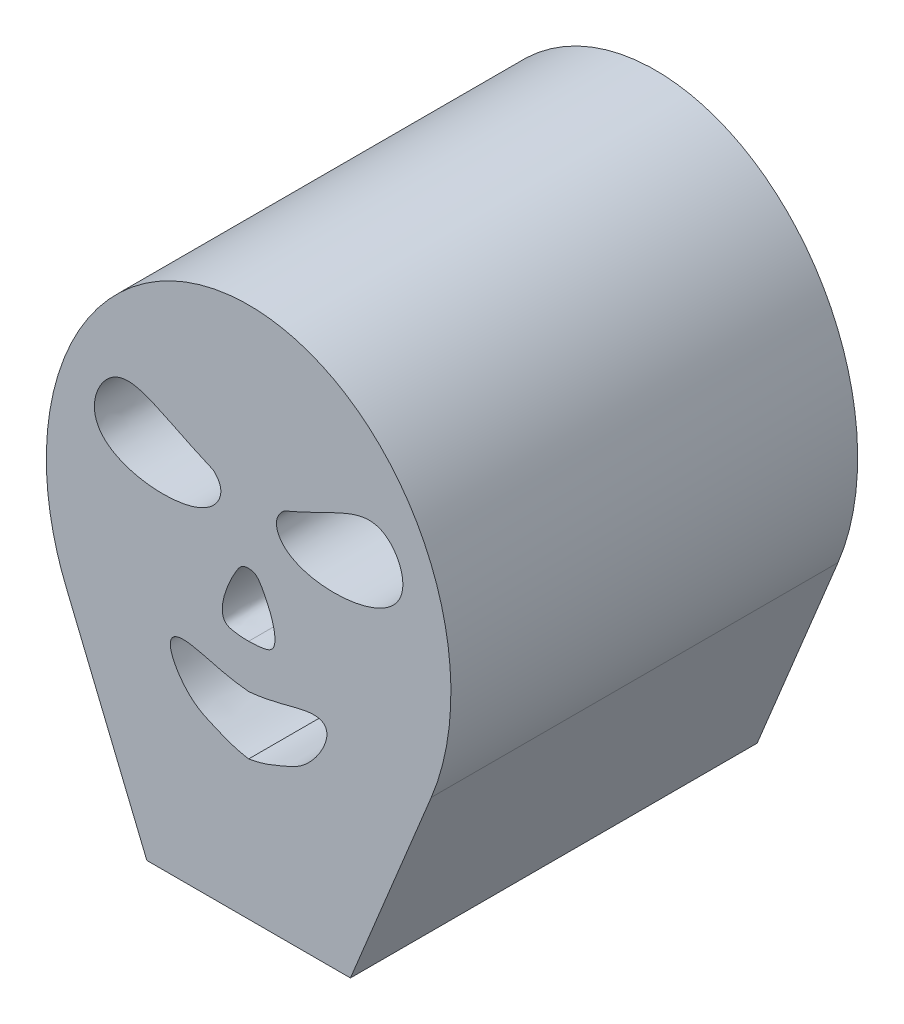
ISO-10303-21;
HEADER;
FILE_DESCRIPTION(('STEP AP214'),'2;1');
FILE_NAME('part.step','',(''),(''),'','','');
FILE_SCHEMA(('AUTOMOTIVE_DESIGN { 1 0 10303 214 1 1 1 1 }'));
ENDSEC;
DATA;
#1=APPLICATION_CONTEXT('core data for automotive mechanical design processes');
#2=APPLICATION_PROTOCOL_DEFINITION('international standard','automotive_design',2000,#1);
#3=PRODUCT_CONTEXT('',#1,'mechanical');
#4=PRODUCT('Part','Part','',(#3));
#5=PRODUCT_RELATED_PRODUCT_CATEGORY('part','',(#4));
#6=PRODUCT_DEFINITION_FORMATION('','',#4);
#7=PRODUCT_DEFINITION_CONTEXT('part definition',#1,'design');
#8=PRODUCT_DEFINITION('design','',#6,#7);
#9=PRODUCT_DEFINITION_SHAPE('','',#8);
#10=(LENGTH_UNIT() NAMED_UNIT(*) SI_UNIT(.MILLI.,.METRE.));
#11=(NAMED_UNIT(*) PLANE_ANGLE_UNIT() SI_UNIT($,.RADIAN.));
#12=(NAMED_UNIT(*) SI_UNIT($,.STERADIAN.) SOLID_ANGLE_UNIT());
#13=UNCERTAINTY_MEASURE_WITH_UNIT(LENGTH_MEASURE(1.E-05),#10,'distance_accuracy_value','');
#14=(GEOMETRIC_REPRESENTATION_CONTEXT(3) GLOBAL_UNCERTAINTY_ASSIGNED_CONTEXT((#13)) GLOBAL_UNIT_ASSIGNED_CONTEXT((#10,
#11,#12)) REPRESENTATION_CONTEXT('',''));
#15=CARTESIAN_POINT('',(0.,0.,0.));
#16=DIRECTION('',(0.,0.,1.));
#17=DIRECTION('',(1.,0.,0.));
#18=AXIS2_PLACEMENT_3D('',#15,#16,#17);
#19=CARTESIAN_POINT('',(-8.064642047272,15.4140386878812,40.));
#20=DIRECTION('',(0.,0.,1.));
#21=DIRECTION('',(1.,0.,0.));
#22=AXIS2_PLACEMENT_3D('',#19,#20,#21);
#23=PLANE('',#22);
#24=CARTESIAN_POINT('',(-8.064642047272,15.4140386878812,40.));
#25=DIRECTION('',(0.,0.,1.));
#26=DIRECTION('',(0.,1.,0.));
#27=AXIS2_PLACEMENT_3D('',#24,#25,#26);
#28=ELLIPSE('',#27,23.0545966616186,19.8957473835431);
#29=CARTESIAN_POINT('',(9.89924815737278,5.50405351147454,40.));
#30=VERTEX_POINT('',#29);
#31=CARTESIAN_POINT('',(-26.0285322519168,5.50405351147454,40.));
#32=VERTEX_POINT('',#31);
#33=EDGE_CURVE('E257',#30,#32,#28,.T.);
#34=ORIENTED_EDGE('',*,*,#33,.T.);
#35=DIRECTION('',(0.380022356894521,-0.924977301483844,0.));
#36=VECTOR('',#35,1.);
#37=CARTESIAN_POINT('',(-26.0285322519168,5.50405351147454,40.));
#38=LINE('',#37,#36);
#39=CARTESIAN_POINT('',(-18.0762874776894,-13.8517706355913,40.));
#40=VERTEX_POINT('',#39);
#41=EDGE_CURVE('E261',#32,#40,#38,.T.);
#42=ORIENTED_EDGE('',*,*,#41,.T.);
#43=DIRECTION('',(1.,0.,0.));
#44=VECTOR('',#43,1.);
#45=CARTESIAN_POINT('',(-18.0762874776894,-13.8517706355913,40.));
#46=LINE('',#45,#44);
#47=CARTESIAN_POINT('',(1.94700338314539,-13.8517706355913,40.));
#48=VERTEX_POINT('',#47);
#49=EDGE_CURVE('E264',#40,#48,#46,.T.);
#50=ORIENTED_EDGE('',*,*,#49,.T.);
#51=DIRECTION('',(0.380022356894521,0.924977301483844,0.));
#52=VECTOR('',#51,1.);
#53=CARTESIAN_POINT('',(9.89924815737278,5.50405351147454,40.));
#54=LINE('',#53,#52);
#55=EDGE_CURVE('E266',#48,#30,#54,.T.);
#56=ORIENTED_EDGE('',*,*,#55,.T.);
#57=EDGE_LOOP('',(#34,#42,#50,#56));
#58=FACE_BOUND('',#57,.T.);
#59=DIRECTION('',(-0.833445640345557,0.552601451852041,0.));
#60=VECTOR('',#59,1.);
#61=CARTESIAN_POINT('',(-11.5967471369434,22.6915395941908,40.));
#62=LINE('',#61,#60);
#63=CARTESIAN_POINT('',(-11.5548218141603,22.6637417473754,40.));
#64=VERTEX_POINT('',#63);
#65=CARTESIAN_POINT('',(-11.5967471369434,22.6915395941908,40.));
#66=VERTEX_POINT('',#65);
#67=EDGE_CURVE('E233',#64,#66,#62,.T.);
#68=ORIENTED_EDGE('',*,*,#67,.F.);
#69=CARTESIAN_POINT('',(-11.5967471369434,22.6915395941908,40.));
#70=CARTESIAN_POINT('',(-21.1696814875945,26.7550091432701,40.));
#71=CARTESIAN_POINT('',(-20.3028079837909,28.7972351380756,40.));
#72=CARTESIAN_POINT('',(-23.3051363778575,25.6278564940178,40.));
#73=CARTESIAN_POINT('',(-24.5512670395752,22.6921566264848,40.));
#74=CARTESIAN_POINT('',(-25.0972126236344,19.9864753193647,40.));
#75=CARTESIAN_POINT('',(-24.6197256741648,18.8046536480547,40.));
#76=CARTESIAN_POINT('',(-22.7689583663723,18.0190495352327,40.));
#77=CARTESIAN_POINT('',(-17.9843212991027,16.5153210880384,40.));
#78=CARTESIAN_POINT('',(-12.4044401506613,16.7076310269674,40.));
#79=CARTESIAN_POINT('',(-11.3713676487825,18.0767617411084,40.));
#80=CARTESIAN_POINT('',(-10.9650206938746,19.0340551761735,40.));
#81=CARTESIAN_POINT('',(-10.3961349570035,20.3742659852647,40.));
#82=CARTESIAN_POINT('',(-10.4539747671032,21.3026395152799,40.));
#83=CARTESIAN_POINT('',(-10.5370742661408,21.6391871556122,40.));
#84=CARTESIAN_POINT('',(-10.9567214055106,21.8926352969069,40.));
#85=CARTESIAN_POINT('',(-11.1175887713707,22.3286636178772,40.));
#86=CARTESIAN_POINT('',(-11.4712503125317,22.6144954516371,40.));
#87=CARTESIAN_POINT('',(-11.5548218141603,22.6637417473754,40.));
#88=B_SPLINE_CURVE_WITH_KNOTS('',18,(#69,#70,#71,#72,#73,#74,#75,#76,#77,#78,#79,#80,#81,#82,
#83,#84,#85,#86,#87),.UNSPECIFIED.,.F.,.F.,(19,19),(0.,1.),.UNSPECIFIED.);
#89=EDGE_CURVE('E226',#66,#64,#88,.T.);
#90=ORIENTED_EDGE('',*,*,#89,.F.);
#91=EDGE_LOOP('',(#68,#90));
#92=FACE_BOUND('',#91,.T.);
#93=DIRECTION('',(-0.833445640345468,-0.552601451852177,0.));
#94=VECTOR('',#93,1.);
#95=CARTESIAN_POINT('',(-4.53253695760064,22.6915395941908,40.));
#96=LINE('',#95,#94);
#97=CARTESIAN_POINT('',(-4.53253695760064,22.6915395941908,40.));
#98=VERTEX_POINT('',#97);
#99=CARTESIAN_POINT('',(-4.57446228038372,22.6637417473754,40.));
#100=VERTEX_POINT('',#99);
#101=EDGE_CURVE('E203',#98,#100,#96,.T.);
#102=ORIENTED_EDGE('',*,*,#101,.F.);
#103=CARTESIAN_POINT('',(-4.57446228038372,22.6637417473754,40.));
#104=CARTESIAN_POINT('',(-4.65803378201228,22.6144954516371,40.));
#105=CARTESIAN_POINT('',(-5.01169532317331,22.3286636178772,40.));
#106=CARTESIAN_POINT('',(-5.17256268903336,21.8926352969069,40.));
#107=CARTESIAN_POINT('',(-5.59220982840323,21.6391871556122,40.));
#108=CARTESIAN_POINT('',(-5.67530932744078,21.3026395152799,40.));
#109=CARTESIAN_POINT('',(-5.73314913754049,20.3742659852647,40.));
#110=CARTESIAN_POINT('',(-5.1642634006694,19.0340551761735,40.));
#111=CARTESIAN_POINT('',(-4.75791644576148,18.0767617411084,40.));
#112=CARTESIAN_POINT('',(-3.72484394388275,16.7076310269674,40.));
#113=CARTESIAN_POINT('',(1.85503720455873,16.5153210880384,40.));
#114=CARTESIAN_POINT('',(6.63967427182828,18.0190495352327,40.));
#115=CARTESIAN_POINT('',(8.49044157962082,18.8046536480547,40.));
#116=CARTESIAN_POINT('',(8.96792852909037,19.9864753193647,40.));
#117=CARTESIAN_POINT('',(8.42198294503116,22.6921566264848,40.));
#118=CARTESIAN_POINT('',(7.17585228331353,25.6278564940178,40.));
#119=CARTESIAN_POINT('',(4.17352388924687,28.7972351380756,40.));
#120=CARTESIAN_POINT('',(5.04039739305044,26.7550091432701,40.));
#121=CARTESIAN_POINT('',(-4.53253695760064,22.6915395941908,40.));
#122=B_SPLINE_CURVE_WITH_KNOTS('',18,(#103,#104,#105,#106,#107,#108,#109,#110,#111,#112,#113,
#114,#115,#116,#117,#118,#119,#120,#121),.UNSPECIFIED.,.F.,.F.,(19,19),(0.,1.),.UNSPECIFIED.);
#123=EDGE_CURVE('E197',#100,#98,#122,.T.);
#124=ORIENTED_EDGE('',*,*,#123,.F.);
#125=EDGE_LOOP('',(#102,#124));
#126=FACE_BOUND('',#125,.T.);
#127=CARTESIAN_POINT('',(-8.064642047272,16.0297341994799,40.));
#128=CARTESIAN_POINT('',(-9.12948055530447,16.0297341994799,40.));
#129=CARTESIAN_POINT('',(-9.12948055530447,15.4140386878812,40.));
#130=CARTESIAN_POINT('',(-9.52714226985032,14.8175461160624,40.));
#131=CARTESIAN_POINT('',(-10.2015984807432,13.5733433450144,40.));
#132=CARTESIAN_POINT('',(-10.6969978598243,12.7476777132126,40.));
#133=CARTESIAN_POINT('',(-11.0036736659221,11.355841362461,40.));
#134=CARTESIAN_POINT('',(-10.9564927726763,10.577356623905,40.));
#135=CARTESIAN_POINT('',(-10.5554551800868,10.2470903711843,40.));
#136=CARTESIAN_POINT('',(-10.3667316071036,10.058366798201,40.));
#137=CARTESIAN_POINT('',(-10.1780080341203,10.0347763515781,40.));
#138=CARTESIAN_POINT('',(-9.30516150907265,9.8224623319719,40.));
#139=CARTESIAN_POINT('',(-8.064642047272,9.8224623319719,40.));
#140=B_SPLINE_CURVE_WITH_KNOTS('',12,(#127,#128,#129,#130,#131,#132,#133,#134,#135,#136,#137,
#138,#139),.UNSPECIFIED.,.F.,.F.,(13,13),(0.,1.),.UNSPECIFIED.);
#141=CARTESIAN_POINT('',(-8.064642047272,16.0297341994799,40.));
#142=VERTEX_POINT('',#141);
#143=CARTESIAN_POINT('',(-8.064642047272,9.8224623319719,40.));
#144=VERTEX_POINT('',#143);
#145=EDGE_CURVE('E161',#142,#144,#140,.T.);
#146=ORIENTED_EDGE('',*,*,#145,.F.);
#147=CARTESIAN_POINT('',(-8.064642047272,9.8224623319719,40.));
#148=CARTESIAN_POINT('',(-6.82412258547134,9.8224623319719,40.));
#149=CARTESIAN_POINT('',(-5.95127606042371,10.0347763515781,40.));
#150=CARTESIAN_POINT('',(-5.76255248744044,10.058366798201,40.));
#151=CARTESIAN_POINT('',(-5.57382891445717,10.2470903711843,40.));
#152=CARTESIAN_POINT('',(-5.17279132186772,10.577356623905,40.));
#153=CARTESIAN_POINT('',(-5.1256104286219,11.355841362461,40.));
#154=CARTESIAN_POINT('',(-5.43228623471971,12.7476777132126,40.));
#155=CARTESIAN_POINT('',(-5.9276856138008,13.5733433450144,40.));
#156=CARTESIAN_POINT('',(-6.60214182469367,14.8175461160624,40.));
#157=CARTESIAN_POINT('',(-6.99980353923952,15.4140386878812,40.));
#158=CARTESIAN_POINT('',(-6.99980353923952,16.0297341994799,40.));
#159=CARTESIAN_POINT('',(-8.064642047272,16.0297341994799,40.));
#160=B_SPLINE_CURVE_WITH_KNOTS('',12,(#147,#148,#149,#150,#151,#152,#153,#154,#155,#156,#157,
#158,#159),.UNSPECIFIED.,.F.,.F.,(13,13),(0.,1.),.UNSPECIFIED.);
#161=EDGE_CURVE('E167',#144,#142,#160,.T.);
#162=ORIENTED_EDGE('',*,*,#161,.F.);
#163=EDGE_LOOP('',(#146,#162));
#164=FACE_BOUND('',#163,.T.);
#165=CARTESIAN_POINT('',(-8.064642047272,5.53977782641324,40.));
#166=CARTESIAN_POINT('',(-11.7491679219027,5.880867327024,40.));
#167=CARTESIAN_POINT('',(-13.8525531756691,6.90413582885626,40.));
#168=CARTESIAN_POINT('',(-15.0463664278067,7.58631483007777,40.));
#169=CARTESIAN_POINT('',(-19.6720326035395,8.59198204066779,40.));
#170=CARTESIAN_POINT('',(-15.4138657636346,3.97625920657237,40.));
#171=CARTESIAN_POINT('',(-14.5037232329679,2.31849959714374,40.));
#172=CARTESIAN_POINT('',(-13.6585908830631,1.50587233761989,40.));
#173=CARTESIAN_POINT('',(-12.8134585331583,1.05080107228654,40.));
#174=CARTESIAN_POINT('',(-11.4482447371582,1.5708825183818,40.));
#175=CARTESIAN_POINT('',(-11.6923196718009,0.423435317251905,40.));
#176=CARTESIAN_POINT('',(-8.064642047272,-0.20189543386781,40.));
#177=B_SPLINE_CURVE_WITH_KNOTS('',11,(#165,#166,#167,#168,#169,#170,#171,#172,#173,#174,#175,
#176),.UNSPECIFIED.,.F.,.F.,(12,12),(0.,1.),.UNSPECIFIED.);
#178=CARTESIAN_POINT('',(-8.064642047272,5.53977782641324,40.));
#179=VERTEX_POINT('',#178);
#180=CARTESIAN_POINT('',(-8.064642047272,-0.20189543386781,40.));
#181=VERTEX_POINT('',#180);
#182=EDGE_CURVE('E122',#179,#181,#177,.T.);
#183=ORIENTED_EDGE('',*,*,#182,.F.);
#184=CARTESIAN_POINT('',(-8.064642047272,-0.20189543386781,40.));
#185=CARTESIAN_POINT('',(-4.43696442274304,0.423435317251905,40.));
#186=CARTESIAN_POINT('',(-4.68103935738576,1.5708825183818,40.));
#187=CARTESIAN_POINT('',(-3.31582556138571,1.05080107228654,40.));
#188=CARTESIAN_POINT('',(-2.47069321148091,1.50587233761989,40.));
#189=CARTESIAN_POINT('',(-1.62556086157611,2.31849959714374,40.));
#190=CARTESIAN_POINT('',(-0.715418330909413,3.97625920657237,40.));
#191=CARTESIAN_POINT('',(3.54274850899552,8.59198204066779,40.));
#192=CARTESIAN_POINT('',(-1.08291766673728,7.58631483007777,40.));
#193=CARTESIAN_POINT('',(-2.27673091887493,6.90413582885626,40.));
#194=CARTESIAN_POINT('',(-4.38011617264125,5.880867327024,40.));
#195=CARTESIAN_POINT('',(-8.064642047272,5.53977782641324,40.));
#196=B_SPLINE_CURVE_WITH_KNOTS('',11,(#184,#185,#186,#187,#188,#189,#190,#191,#192,#193,#194,
#195),.UNSPECIFIED.,.F.,.F.,(12,12),(0.,1.),.UNSPECIFIED.);
#197=EDGE_CURVE('E128',#181,#179,#196,.T.);
#198=ORIENTED_EDGE('',*,*,#197,.F.);
#199=EDGE_LOOP('',(#183,#198));
#200=FACE_BOUND('',#199,.T.);
#201=ADVANCED_FACE('F33',(#58,#92,#126,#164,#200),#23,.T.);
#202=CARTESIAN_POINT('',(-8.064642047272,15.4140386878812,0.));
#203=DIRECTION('',(0.,0.,1.));
#204=DIRECTION('',(1.,0.,0.));
#205=AXIS2_PLACEMENT_3D('',#202,#203,#204);
#206=PLANE('',#205);
#207=CARTESIAN_POINT('',(-8.064642047272,9.8224623319719,0.));
#208=CARTESIAN_POINT('',(-6.82412258547134,9.8224623319719,0.));
#209=CARTESIAN_POINT('',(-5.95127606042371,10.0347763515781,0.));
#210=CARTESIAN_POINT('',(-5.76255248744044,10.058366798201,0.));
#211=CARTESIAN_POINT('',(-5.57382891445717,10.2470903711843,0.));
#212=CARTESIAN_POINT('',(-5.17279132186772,10.577356623905,0.));
#213=CARTESIAN_POINT('',(-5.1256104286219,11.355841362461,0.));
#214=CARTESIAN_POINT('',(-5.43228623471971,12.7476777132126,0.));
#215=CARTESIAN_POINT('',(-5.9276856138008,13.5733433450144,0.));
#216=CARTESIAN_POINT('',(-6.60214182469367,14.8175461160624,0.));
#217=CARTESIAN_POINT('',(-6.99980353923952,15.4140386878812,0.));
#218=CARTESIAN_POINT('',(-6.99980353923952,16.0297341994799,0.));
#219=CARTESIAN_POINT('',(-8.064642047272,16.0297341994799,0.));
#220=B_SPLINE_CURVE_WITH_KNOTS('',12,(#207,#208,#209,#210,#211,#212,#213,#214,#215,#216,#217,
#218,#219),.UNSPECIFIED.,.F.,.F.,(13,13),(0.,1.),.UNSPECIFIED.);
#221=CARTESIAN_POINT('',(-8.064642047272,9.8224623319719,0.));
#222=VERTEX_POINT('',#221);
#223=CARTESIAN_POINT('',(-8.064642047272,16.0297341994799,0.));
#224=VERTEX_POINT('',#223);
#225=EDGE_CURVE('E172',#222,#224,#220,.T.);
#226=ORIENTED_EDGE('',*,*,#225,.T.);
#227=CARTESIAN_POINT('',(-8.064642047272,16.0297341994799,0.));
#228=CARTESIAN_POINT('',(-9.12948055530447,16.0297341994799,0.));
#229=CARTESIAN_POINT('',(-9.12948055530447,15.4140386878812,0.));
#230=CARTESIAN_POINT('',(-9.52714226985032,14.8175461160624,0.));
#231=CARTESIAN_POINT('',(-10.2015984807432,13.5733433450144,0.));
#232=CARTESIAN_POINT('',(-10.6969978598243,12.7476777132126,0.));
#233=CARTESIAN_POINT('',(-11.0036736659221,11.355841362461,0.));
#234=CARTESIAN_POINT('',(-10.9564927726763,10.577356623905,0.));
#235=CARTESIAN_POINT('',(-10.5554551800868,10.2470903711843,0.));
#236=CARTESIAN_POINT('',(-10.3667316071036,10.058366798201,0.));
#237=CARTESIAN_POINT('',(-10.1780080341203,10.0347763515781,0.));
#238=CARTESIAN_POINT('',(-9.30516150907265,9.8224623319719,0.));
#239=CARTESIAN_POINT('',(-8.064642047272,9.8224623319719,0.));
#240=B_SPLINE_CURVE_WITH_KNOTS('',12,(#227,#228,#229,#230,#231,#232,#233,#234,#235,#236,#237,
#238,#239),.UNSPECIFIED.,.F.,.F.,(13,13),(0.,1.),.UNSPECIFIED.);
#241=EDGE_CURVE('E180',#224,#222,#240,.T.);
#242=ORIENTED_EDGE('',*,*,#241,.T.);
#243=EDGE_LOOP('',(#226,#242));
#244=FACE_BOUND('',#243,.T.);
#245=CARTESIAN_POINT('',(-11.5967471369434,22.6915395941908,0.));
#246=CARTESIAN_POINT('',(-21.1696814875945,26.7550091432701,0.));
#247=CARTESIAN_POINT('',(-20.3028079837909,28.7972351380756,0.));
#248=CARTESIAN_POINT('',(-23.3051363778575,25.6278564940178,0.));
#249=CARTESIAN_POINT('',(-24.5512670395752,22.6921566264848,0.));
#250=CARTESIAN_POINT('',(-25.0972126236344,19.9864753193647,0.));
#251=CARTESIAN_POINT('',(-24.6197256741648,18.8046536480547,0.));
#252=CARTESIAN_POINT('',(-22.7689583663723,18.0190495352327,0.));
#253=CARTESIAN_POINT('',(-17.9843212991027,16.5153210880384,0.));
#254=CARTESIAN_POINT('',(-12.4044401506613,16.7076310269674,0.));
#255=CARTESIAN_POINT('',(-11.3713676487825,18.0767617411084,0.));
#256=CARTESIAN_POINT('',(-10.9650206938746,19.0340551761735,0.));
#257=CARTESIAN_POINT('',(-10.3961349570035,20.3742659852647,0.));
#258=CARTESIAN_POINT('',(-10.4539747671032,21.3026395152799,0.));
#259=CARTESIAN_POINT('',(-10.5370742661408,21.6391871556122,0.));
#260=CARTESIAN_POINT('',(-10.9567214055106,21.8926352969069,0.));
#261=CARTESIAN_POINT('',(-11.1175887713707,22.3286636178772,0.));
#262=CARTESIAN_POINT('',(-11.4712503125317,22.6144954516371,0.));
#263=CARTESIAN_POINT('',(-11.5548218141603,22.6637417473754,0.));
#264=B_SPLINE_CURVE_WITH_KNOTS('',18,(#245,#246,#247,#248,#249,#250,#251,#252,#253,#254,#255,
#256,#257,#258,#259,#260,#261,#262,#263),.UNSPECIFIED.,.F.,.F.,(19,19),(0.,1.),.UNSPECIFIED.);
#265=CARTESIAN_POINT('',(-11.5967471369434,22.6915395941908,0.));
#266=VERTEX_POINT('',#265);
#267=CARTESIAN_POINT('',(-11.5548218141603,22.6637417473754,0.));
#268=VERTEX_POINT('',#267);
#269=EDGE_CURVE('E242',#266,#268,#264,.T.);
#270=ORIENTED_EDGE('',*,*,#269,.T.);
#271=DIRECTION('',(-0.833445640345557,0.552601451852041,0.));
#272=VECTOR('',#271,1.);
#273=CARTESIAN_POINT('',(-11.5967471369434,22.6915395941908,0.));
#274=LINE('',#273,#272);
#275=EDGE_CURVE('E234',#268,#266,#274,.T.);
#276=ORIENTED_EDGE('',*,*,#275,.T.);
#277=EDGE_LOOP('',(#270,#276));
#278=FACE_BOUND('',#277,.T.);
#279=CARTESIAN_POINT('',(-8.064642047272,15.4140386878812,0.));
#280=DIRECTION('',(0.,0.,1.));
#281=DIRECTION('',(0.,1.,0.));
#282=AXIS2_PLACEMENT_3D('',#279,#280,#281);
#283=ELLIPSE('',#282,23.0545966616186,19.8957473835431);
#284=CARTESIAN_POINT('',(9.89924815737278,5.50405351147454,0.));
#285=VERTEX_POINT('',#284);
#286=CARTESIAN_POINT('',(-26.0285322519168,5.50405351147454,0.));
#287=VERTEX_POINT('',#286);
#288=EDGE_CURVE('E256',#285,#287,#283,.T.);
#289=ORIENTED_EDGE('',*,*,#288,.F.);
#290=DIRECTION('',(0.380022356894521,0.924977301483844,0.));
#291=VECTOR('',#290,1.);
#292=CARTESIAN_POINT('',(9.89924815737278,5.50405351147454,0.));
#293=LINE('',#292,#291);
#294=CARTESIAN_POINT('',(1.94700338314539,-13.8517706355913,0.));
#295=VERTEX_POINT('',#294);
#296=EDGE_CURVE('E262',#295,#285,#293,.T.);
#297=ORIENTED_EDGE('',*,*,#296,.F.);
#298=DIRECTION('',(1.,0.,0.));
#299=VECTOR('',#298,1.);
#300=CARTESIAN_POINT('',(1.94700338314539,-13.8517706355913,0.));
#301=LINE('',#300,#299);
#302=CARTESIAN_POINT('',(-18.0762874776894,-13.8517706355913,0.));
#303=VERTEX_POINT('',#302);
#304=EDGE_CURVE('E274',#303,#295,#301,.T.);
#305=ORIENTED_EDGE('',*,*,#304,.F.);
#306=DIRECTION('',(0.380022356894521,-0.924977301483844,0.));
#307=VECTOR('',#306,1.);
#308=CARTESIAN_POINT('',(-26.0285322519168,5.50405351147454,0.));
#309=LINE('',#308,#307);
#310=EDGE_CURVE('E271',#287,#303,#309,.T.);
#311=ORIENTED_EDGE('',*,*,#310,.F.);
#312=EDGE_LOOP('',(#289,#297,#305,#311));
#313=FACE_BOUND('',#312,.T.);
#314=CARTESIAN_POINT('',(-4.57446228038372,22.6637417473754,0.));
#315=CARTESIAN_POINT('',(-4.65803378201228,22.6144954516371,0.));
#316=CARTESIAN_POINT('',(-5.01169532317331,22.3286636178772,0.));
#317=CARTESIAN_POINT('',(-5.17256268903336,21.8926352969069,0.));
#318=CARTESIAN_POINT('',(-5.59220982840323,21.6391871556122,0.));
#319=CARTESIAN_POINT('',(-5.67530932744078,21.3026395152799,0.));
#320=CARTESIAN_POINT('',(-5.73314913754049,20.3742659852647,0.));
#321=CARTESIAN_POINT('',(-5.1642634006694,19.0340551761735,0.));
#322=CARTESIAN_POINT('',(-4.75791644576148,18.0767617411084,0.));
#323=CARTESIAN_POINT('',(-3.72484394388275,16.7076310269674,0.));
#324=CARTESIAN_POINT('',(1.85503720455873,16.5153210880384,0.));
#325=CARTESIAN_POINT('',(6.63967427182828,18.0190495352327,0.));
#326=CARTESIAN_POINT('',(8.49044157962082,18.8046536480547,0.));
#327=CARTESIAN_POINT('',(8.96792852909037,19.9864753193647,0.));
#328=CARTESIAN_POINT('',(8.42198294503116,22.6921566264848,0.));
#329=CARTESIAN_POINT('',(7.17585228331353,25.6278564940178,0.));
#330=CARTESIAN_POINT('',(4.17352388924687,28.7972351380756,0.));
#331=CARTESIAN_POINT('',(5.04039739305044,26.7550091432701,0.));
#332=CARTESIAN_POINT('',(-4.53253695760064,22.6915395941908,0.));
#333=B_SPLINE_CURVE_WITH_KNOTS('',18,(#314,#315,#316,#317,#318,#319,#320,#321,#322,#323,#324,
#325,#326,#327,#328,#329,#330,#331,#332),.UNSPECIFIED.,.F.,.F.,(19,19),(0.,1.),.UNSPECIFIED.);
#334=CARTESIAN_POINT('',(-4.57446228038372,22.6637417473754,0.));
#335=VERTEX_POINT('',#334);
#336=CARTESIAN_POINT('',(-4.53253695760064,22.6915395941908,0.));
#337=VERTEX_POINT('',#336);
#338=EDGE_CURVE('E196',#335,#337,#333,.T.);
#339=ORIENTED_EDGE('',*,*,#338,.T.);
#340=DIRECTION('',(-0.833445640345468,-0.552601451852177,0.));
#341=VECTOR('',#340,1.);
#342=CARTESIAN_POINT('',(-4.53253695760064,22.6915395941908,0.));
#343=LINE('',#342,#341);
#344=EDGE_CURVE('E204',#337,#335,#343,.T.);
#345=ORIENTED_EDGE('',*,*,#344,.T.);
#346=EDGE_LOOP('',(#339,#345));
#347=FACE_BOUND('',#346,.T.);
#348=CARTESIAN_POINT('',(-8.064642047272,-0.20189543386781,0.));
#349=CARTESIAN_POINT('',(-4.43696442274304,0.423435317251905,0.));
#350=CARTESIAN_POINT('',(-4.68103935738576,1.5708825183818,0.));
#351=CARTESIAN_POINT('',(-3.31582556138571,1.05080107228654,0.));
#352=CARTESIAN_POINT('',(-2.47069321148091,1.50587233761989,0.));
#353=CARTESIAN_POINT('',(-1.62556086157611,2.31849959714374,0.));
#354=CARTESIAN_POINT('',(-0.715418330909413,3.97625920657237,0.));
#355=CARTESIAN_POINT('',(3.54274850899552,8.59198204066779,0.));
#356=CARTESIAN_POINT('',(-1.08291766673728,7.58631483007777,0.));
#357=CARTESIAN_POINT('',(-2.27673091887493,6.90413582885626,0.));
#358=CARTESIAN_POINT('',(-4.38011617264125,5.880867327024,0.));
#359=CARTESIAN_POINT('',(-8.064642047272,5.53977782641324,0.));
#360=B_SPLINE_CURVE_WITH_KNOTS('',11,(#348,#349,#350,#351,#352,#353,#354,#355,#356,#357,#358,
#359),.UNSPECIFIED.,.F.,.F.,(12,12),(0.,1.),.UNSPECIFIED.);
#361=CARTESIAN_POINT('',(-8.064642047272,-0.20189543386781,0.));
#362=VERTEX_POINT('',#361);
#363=CARTESIAN_POINT('',(-8.064642047272,5.53977782641324,0.));
#364=VERTEX_POINT('',#363);
#365=EDGE_CURVE('E56',#362,#364,#360,.T.);
#366=ORIENTED_EDGE('',*,*,#365,.T.);
#367=CARTESIAN_POINT('',(-8.064642047272,5.53977782641324,0.));
#368=CARTESIAN_POINT('',(-11.7491679219027,5.880867327024,0.));
#369=CARTESIAN_POINT('',(-13.8525531756691,6.90413582885626,0.));
#370=CARTESIAN_POINT('',(-15.0463664278067,7.58631483007777,0.));
#371=CARTESIAN_POINT('',(-19.6720326035395,8.59198204066779,0.));
#372=CARTESIAN_POINT('',(-15.4138657636346,3.97625920657237,0.));
#373=CARTESIAN_POINT('',(-14.5037232329679,2.31849959714374,0.));
#374=CARTESIAN_POINT('',(-13.6585908830631,1.50587233761989,0.));
#375=CARTESIAN_POINT('',(-12.8134585331583,1.05080107228654,0.));
#376=CARTESIAN_POINT('',(-11.4482447371582,1.5708825183818,0.));
#377=CARTESIAN_POINT('',(-11.6923196718009,0.423435317251905,0.));
#378=CARTESIAN_POINT('',(-8.064642047272,-0.20189543386781,0.));
#379=B_SPLINE_CURVE_WITH_KNOTS('',11,(#367,#368,#369,#370,#371,#372,#373,#374,#375,#376,#377,
#378),.UNSPECIFIED.,.F.,.F.,(12,12),(0.,1.),.UNSPECIFIED.);
#380=EDGE_CURVE('E132',#364,#362,#379,.T.);
#381=ORIENTED_EDGE('',*,*,#380,.T.);
#382=EDGE_LOOP('',(#366,#381));
#383=FACE_BOUND('',#382,.T.);
#384=ADVANCED_FACE('F292',(#244,#278,#313,#347,#383),#206,.F.);
#385=DIRECTION('',(0.,0.,-1.));
#386=VECTOR('',#385,1.);
#387=SURFACE_OF_LINEAR_EXTRUSION('',#28,#386);
#388=ORIENTED_EDGE('',*,*,#288,.T.);
#389=DIRECTION('',(0.,0.,-1.));
#390=VECTOR('',#389,1.);
#391=CARTESIAN_POINT('',(-26.0285322519168,5.50405351147454,40.));
#392=LINE('',#391,#390);
#393=EDGE_CURVE('E11',#32,#287,#392,.T.);
#394=ORIENTED_EDGE('',*,*,#393,.F.);
#395=ORIENTED_EDGE('',*,*,#33,.F.);
#396=DIRECTION('',(0.,0.,-1.));
#397=VECTOR('',#396,1.);
#398=CARTESIAN_POINT('',(9.89924815737278,5.50405351147454,40.));
#399=LINE('',#398,#397);
#400=EDGE_CURVE('E268',#30,#285,#399,.T.);
#401=ORIENTED_EDGE('',*,*,#400,.T.);
#402=EDGE_LOOP('',(#388,#394,#395,#401));
#403=FACE_BOUND('',#402,.T.);
#404=ADVANCED_FACE('F35',(#403),#387,.F.);
#405=CARTESIAN_POINT('',(-26.0285322519168,5.50405351147454,40.));
#406=DIRECTION('',(0.924977301483844,0.380022356894521,0.));
#407=DIRECTION('',(-0.380022356894521,0.924977301483844,0.));
#408=AXIS2_PLACEMENT_3D('',#405,#406,#407);
#409=PLANE('',#408);
#410=ORIENTED_EDGE('',*,*,#310,.T.);
#411=DIRECTION('',(0.,0.,-1.));
#412=VECTOR('',#411,1.);
#413=CARTESIAN_POINT('',(-18.0762874776894,-13.8517706355913,40.));
#414=LINE('',#413,#412);
#415=EDGE_CURVE('E42',#40,#303,#414,.T.);
#416=ORIENTED_EDGE('',*,*,#415,.F.);
#417=ORIENTED_EDGE('',*,*,#41,.F.);
#418=ORIENTED_EDGE('',*,*,#393,.T.);
#419=EDGE_LOOP('',(#410,#416,#417,#418));
#420=FACE_BOUND('',#419,.T.);
#421=ADVANCED_FACE('F288',(#420),#409,.F.);
#422=CARTESIAN_POINT('',(1.94700338314539,-13.8517706355913,40.));
#423=DIRECTION('',(0.,1.,0.));
#424=DIRECTION('',(0.,0.,1.));
#425=AXIS2_PLACEMENT_3D('',#422,#423,#424);
#426=PLANE('',#425);
#427=CARTESIAN_POINT('',(-8.06464204727199,-13.8517706355913,8.));
#428=DIRECTION('',(0.,-1.,0.));
#429=DIRECTION('',(0.,0.,-1.));
#430=AXIS2_PLACEMENT_3D('',#427,#428,#429);
#431=CIRCLE('',#430,1.);
#432=CARTESIAN_POINT('',(-8.06464204727199,-13.8517706355913,7.));
#433=VERTEX_POINT('',#432);
#434=EDGE_CURVE('E501',#433,#433,#431,.T.);
#435=ORIENTED_EDGE('',*,*,#434,.F.);
#436=EDGE_LOOP('',(#435));
#437=FACE_BOUND('',#436,.T.);
#438=CARTESIAN_POINT('',(-15.0762874776894,-13.8517706355913,19.8642693323263));
#439=DIRECTION('',(0.,-1.,0.));
#440=DIRECTION('',(0.,0.,-1.));
#441=AXIS2_PLACEMENT_3D('',#438,#439,#440);
#442=CIRCLE('',#441,0.950480175407983);
#443=CARTESIAN_POINT('',(-15.0762874776894,-13.8517706355913,18.9137891569183));
#444=VERTEX_POINT('',#443);
#445=EDGE_CURVE('E511',#444,#444,#442,.T.);
#446=ORIENTED_EDGE('',*,*,#445,.F.);
#447=EDGE_LOOP('',(#446));
#448=FACE_BOUND('',#447,.T.);
#449=CARTESIAN_POINT('',(-1.05299661685461,-13.8517706355913,19.8642693323263));
#450=DIRECTION('',(0.,-1.,0.));
#451=DIRECTION('',(0.,0.,-1.));
#452=AXIS2_PLACEMENT_3D('',#449,#450,#451);
#453=CIRCLE('',#452,0.950480175407984);
#454=CARTESIAN_POINT('',(-1.05299661685461,-13.8517706355913,18.9137891569183));
#455=VERTEX_POINT('',#454);
#456=EDGE_CURVE('E517',#455,#455,#453,.T.);
#457=ORIENTED_EDGE('',*,*,#456,.F.);
#458=EDGE_LOOP('',(#457));
#459=FACE_BOUND('',#458,.T.);
#460=CARTESIAN_POINT('',(-8.064642047272,-13.8517706355913,32.));
#461=DIRECTION('',(0.,-1.,0.));
#462=DIRECTION('',(0.,0.,-1.));
#463=AXIS2_PLACEMENT_3D('',#460,#461,#462);
#464=CIRCLE('',#463,1.);
#465=CARTESIAN_POINT('',(-8.064642047272,-13.8517706355913,31.));
#466=VERTEX_POINT('',#465);
#467=EDGE_CURVE('E139',#466,#466,#464,.T.);
#468=ORIENTED_EDGE('',*,*,#467,.F.);
#469=EDGE_LOOP('',(#468));
#470=FACE_BOUND('',#469,.T.);
#471=ORIENTED_EDGE('',*,*,#304,.T.);
#472=DIRECTION('',(0.,0.,-1.));
#473=VECTOR('',#472,1.);
#474=CARTESIAN_POINT('',(1.94700338314539,-13.8517706355913,40.));
#475=LINE('',#474,#473);
#476=EDGE_CURVE('E279',#48,#295,#475,.T.);
#477=ORIENTED_EDGE('',*,*,#476,.F.);
#478=ORIENTED_EDGE('',*,*,#49,.F.);
#479=ORIENTED_EDGE('',*,*,#415,.T.);
#480=EDGE_LOOP('',(#471,#477,#478,#479));
#481=FACE_BOUND('',#480,.T.);
#482=ADVANCED_FACE('F285',(#437,#448,#459,#470,#481),#426,.F.);
#483=CARTESIAN_POINT('',(9.89924815737278,5.50405351147454,40.));
#484=DIRECTION('',(-0.924977301483844,0.380022356894521,0.));
#485=DIRECTION('',(-0.380022356894521,-0.924977301483844,0.));
#486=AXIS2_PLACEMENT_3D('',#483,#484,#485);
#487=PLANE('',#486);
#488=ORIENTED_EDGE('',*,*,#296,.T.);
#489=ORIENTED_EDGE('',*,*,#400,.F.);
#490=ORIENTED_EDGE('',*,*,#55,.F.);
#491=ORIENTED_EDGE('',*,*,#476,.T.);
#492=EDGE_LOOP('',(#488,#489,#490,#491));
#493=FACE_BOUND('',#492,.T.);
#494=ADVANCED_FACE('F223',(#493),#487,.F.);
#495=DIRECTION('',(0.,0.,-1.));
#496=VECTOR('',#495,1.);
#497=SURFACE_OF_LINEAR_EXTRUSION('',#88,#496);
#498=ORIENTED_EDGE('',*,*,#269,.F.);
#499=DIRECTION('',(0.,0.,-1.));
#500=VECTOR('',#499,1.);
#501=CARTESIAN_POINT('',(-11.5967471369434,22.6915395941908,40.));
#502=LINE('',#501,#500);
#503=EDGE_CURVE('E241',#66,#266,#502,.T.);
#504=ORIENTED_EDGE('',*,*,#503,.F.);
#505=ORIENTED_EDGE('',*,*,#89,.T.);
#506=DIRECTION('',(0.,0.,-1.));
#507=VECTOR('',#506,1.);
#508=CARTESIAN_POINT('',(-11.5548218141603,22.6637417473754,40.));
#509=LINE('',#508,#507);
#510=EDGE_CURVE('E254',#64,#268,#509,.T.);
#511=ORIENTED_EDGE('',*,*,#510,.T.);
#512=EDGE_LOOP('',(#498,#504,#505,#511));
#513=FACE_BOUND('',#512,.T.);
#514=ADVANCED_FACE('F218',(#513),#497,.T.);
#515=CARTESIAN_POINT('',(-11.5967471369434,22.6915395941908,40.));
#516=DIRECTION('',(-0.552601451852041,-0.833445640345557,0.));
#517=DIRECTION('',(0.833445640345557,-0.552601451852041,0.));
#518=AXIS2_PLACEMENT_3D('',#515,#516,#517);
#519=PLANE('',#518);
#520=ORIENTED_EDGE('',*,*,#275,.F.);
#521=ORIENTED_EDGE('',*,*,#510,.F.);
#522=ORIENTED_EDGE('',*,*,#67,.T.);
#523=ORIENTED_EDGE('',*,*,#503,.T.);
#524=EDGE_LOOP('',(#520,#521,#522,#523));
#525=FACE_BOUND('',#524,.T.);
#526=ADVANCED_FACE('F214',(#525),#519,.T.);
#527=DIRECTION('',(0.,0.,-1.));
#528=VECTOR('',#527,1.);
#529=SURFACE_OF_LINEAR_EXTRUSION('',#122,#528);
#530=ORIENTED_EDGE('',*,*,#338,.F.);
#531=DIRECTION('',(0.,0.,-1.));
#532=VECTOR('',#531,1.);
#533=CARTESIAN_POINT('',(-4.57446228038372,22.6637417473754,40.));
#534=LINE('',#533,#532);
#535=EDGE_CURVE('E549',#100,#335,#534,.T.);
#536=ORIENTED_EDGE('',*,*,#535,.F.);
#537=ORIENTED_EDGE('',*,*,#123,.T.);
#538=DIRECTION('',(0.,0.,-1.));
#539=VECTOR('',#538,1.);
#540=CARTESIAN_POINT('',(-4.53253695760064,22.6915395941908,40.));
#541=LINE('',#540,#539);
#542=EDGE_CURVE('E235',#98,#337,#541,.T.);
#543=ORIENTED_EDGE('',*,*,#542,.T.);
#544=EDGE_LOOP('',(#530,#536,#537,#543));
#545=FACE_BOUND('',#544,.T.);
#546=ADVANCED_FACE('F210',(#545),#529,.T.);
#547=CARTESIAN_POINT('',(-4.53253695760064,22.6915395941908,40.));
#548=DIRECTION('',(0.552601451852177,-0.833445640345467,0.));
#549=DIRECTION('',(0.833445640345467,0.552601451852177,0.));
#550=AXIS2_PLACEMENT_3D('',#547,#548,#549);
#551=PLANE('',#550);
#552=ORIENTED_EDGE('',*,*,#344,.F.);
#553=ORIENTED_EDGE('',*,*,#542,.F.);
#554=ORIENTED_EDGE('',*,*,#101,.T.);
#555=ORIENTED_EDGE('',*,*,#535,.T.);
#556=EDGE_LOOP('',(#552,#553,#554,#555));
#557=FACE_BOUND('',#556,.T.);
#558=ADVANCED_FACE('F213',(#557),#551,.T.);
#559=DIRECTION('',(0.,0.,-1.));
#560=VECTOR('',#559,1.);
#561=SURFACE_OF_LINEAR_EXTRUSION('',#160,#560);
#562=ORIENTED_EDGE('',*,*,#225,.F.);
#563=DIRECTION('',(0.,0.,-1.));
#564=VECTOR('',#563,1.);
#565=CARTESIAN_POINT('',(-8.064642047272,9.8224623319719,40.));
#566=LINE('',#565,#564);
#567=EDGE_CURVE('E166',#144,#222,#566,.T.);
#568=ORIENTED_EDGE('',*,*,#567,.F.);
#569=ORIENTED_EDGE('',*,*,#161,.T.);
#570=DIRECTION('',(0.,0.,-1.));
#571=VECTOR('',#570,1.);
#572=CARTESIAN_POINT('',(-8.064642047272,16.0297341994799,40.));
#573=LINE('',#572,#571);
#574=EDGE_CURVE('E193',#142,#224,#573,.T.);
#575=ORIENTED_EDGE('',*,*,#574,.T.);
#576=EDGE_LOOP('',(#562,#568,#569,#575));
#577=FACE_BOUND('',#576,.T.);
#578=ADVANCED_FACE('F157',(#577),#561,.T.);
#579=DIRECTION('',(0.,0.,-1.));
#580=VECTOR('',#579,1.);
#581=SURFACE_OF_LINEAR_EXTRUSION('',#140,#580);
#582=ORIENTED_EDGE('',*,*,#241,.F.);
#583=ORIENTED_EDGE('',*,*,#574,.F.);
#584=ORIENTED_EDGE('',*,*,#145,.T.);
#585=ORIENTED_EDGE('',*,*,#567,.T.);
#586=EDGE_LOOP('',(#582,#583,#584,#585));
#587=FACE_BOUND('',#586,.T.);
#588=ADVANCED_FACE('F152',(#587),#581,.T.);
#589=DIRECTION('',(0.,0.,-1.));
#590=VECTOR('',#589,1.);
#591=SURFACE_OF_LINEAR_EXTRUSION('',#196,#590);
#592=ORIENTED_EDGE('',*,*,#365,.F.);
#593=DIRECTION('',(0.,0.,-1.));
#594=VECTOR('',#593,1.);
#595=CARTESIAN_POINT('',(-8.064642047272,-0.20189543386781,40.));
#596=LINE('',#595,#594);
#597=EDGE_CURVE('E124',#181,#362,#596,.T.);
#598=ORIENTED_EDGE('',*,*,#597,.F.);
#599=ORIENTED_EDGE('',*,*,#197,.T.);
#600=DIRECTION('',(0.,0.,-1.));
#601=VECTOR('',#600,1.);
#602=CARTESIAN_POINT('',(-8.064642047272,5.53977782641324,40.));
#603=LINE('',#602,#601);
#604=EDGE_CURVE('E49',#179,#364,#603,.T.);
#605=ORIENTED_EDGE('',*,*,#604,.T.);
#606=EDGE_LOOP('',(#592,#598,#599,#605));
#607=FACE_BOUND('',#606,.T.);
#608=ADVANCED_FACE('F130',(#607),#591,.T.);
#609=DIRECTION('',(0.,0.,-1.));
#610=VECTOR('',#609,1.);
#611=SURFACE_OF_LINEAR_EXTRUSION('',#177,#610);
#612=ORIENTED_EDGE('',*,*,#380,.F.);
#613=ORIENTED_EDGE('',*,*,#604,.F.);
#614=ORIENTED_EDGE('',*,*,#182,.T.);
#615=ORIENTED_EDGE('',*,*,#597,.T.);
#616=EDGE_LOOP('',(#612,#613,#614,#615));
#617=FACE_BOUND('',#616,.T.);
#618=ADVANCED_FACE('F123',(#617),#611,.T.);
#619=CARTESIAN_POINT('',(-8.064642047272,-3.85177063559134,32.));
#620=DIRECTION('',(0.,-1.,0.));
#621=DIRECTION('',(0.,0.,-1.));
#622=AXIS2_PLACEMENT_3D('',#619,#620,#621);
#623=CYLINDRICAL_SURFACE('',#622,1.);
#624=CARTESIAN_POINT('',(-8.064642047272,-3.85177063559134,32.));
#625=DIRECTION('',(0.,-1.,0.));
#626=DIRECTION('',(0.,0.,-1.));
#627=AXIS2_PLACEMENT_3D('',#624,#625,#626);
#628=CIRCLE('',#627,1.);
#629=CARTESIAN_POINT('',(-8.064642047272,-3.85177063559134,31.));
#630=VERTEX_POINT('',#629);
#631=EDGE_CURVE('E504',#630,#630,#628,.T.);
#632=ORIENTED_EDGE('',*,*,#631,.F.);
#633=EDGE_LOOP('',(#632));
#634=FACE_BOUND('',#633,.T.);
#635=ORIENTED_EDGE('',*,*,#467,.T.);
#636=EDGE_LOOP('',(#635));
#637=FACE_BOUND('',#636,.T.);
#638=ADVANCED_FACE('F377',(#634,#637),#623,.F.);
#639=CARTESIAN_POINT('',(-8.064642047272,-3.85177063559134,32.));
#640=DIRECTION('',(0.,-1.,0.));
#641=DIRECTION('',(0.,0.,-1.));
#642=AXIS2_PLACEMENT_3D('',#639,#640,#641);
#643=PLANE('',#642);
#644=ORIENTED_EDGE('',*,*,#631,.T.);
#645=EDGE_LOOP('',(#644));
#646=FACE_BOUND('',#645,.T.);
#647=ADVANCED_FACE('F382',(#646),#643,.T.);
#648=CARTESIAN_POINT('',(-1.05299661685461,-3.85177063559134,19.8642693323263));
#649=DIRECTION('',(0.,-1.,0.));
#650=DIRECTION('',(0.,0.,-1.));
#651=AXIS2_PLACEMENT_3D('',#648,#649,#650);
#652=CYLINDRICAL_SURFACE('',#651,0.950480175407984);
#653=CARTESIAN_POINT('',(-1.05299661685461,-3.85177063559134,19.8642693323263));
#654=DIRECTION('',(0.,-1.,0.));
#655=DIRECTION('',(0.,0.,-1.));
#656=AXIS2_PLACEMENT_3D('',#653,#654,#655);
#657=CIRCLE('',#656,0.950480175407984);
#658=CARTESIAN_POINT('',(-1.05299661685461,-3.85177063559134,18.9137891569183));
#659=VERTEX_POINT('',#658);
#660=EDGE_CURVE('E514',#659,#659,#657,.T.);
#661=ORIENTED_EDGE('',*,*,#660,.F.);
#662=EDGE_LOOP('',(#661));
#663=FACE_BOUND('',#662,.T.);
#664=ORIENTED_EDGE('',*,*,#456,.T.);
#665=EDGE_LOOP('',(#664));
#666=FACE_BOUND('',#665,.T.);
#667=ADVANCED_FACE('F389',(#663,#666),#652,.F.);
#668=CARTESIAN_POINT('',(-1.05299661685461,-3.85177063559134,19.8642693323263));
#669=DIRECTION('',(0.,-1.,0.));
#670=DIRECTION('',(0.,0.,-1.));
#671=AXIS2_PLACEMENT_3D('',#668,#669,#670);
#672=PLANE('',#671);
#673=ORIENTED_EDGE('',*,*,#660,.T.);
#674=EDGE_LOOP('',(#673));
#675=FACE_BOUND('',#674,.T.);
#676=ADVANCED_FACE('F397',(#675),#672,.T.);
#677=CARTESIAN_POINT('',(-15.0762874776894,-3.85177063559134,19.8642693323263));
#678=DIRECTION('',(0.,-1.,0.));
#679=DIRECTION('',(0.,0.,-1.));
#680=AXIS2_PLACEMENT_3D('',#677,#678,#679);
#681=CYLINDRICAL_SURFACE('',#680,0.950480175407983);
#682=CARTESIAN_POINT('',(-15.0762874776894,-3.85177063559134,19.8642693323263));
#683=DIRECTION('',(0.,-1.,0.));
#684=DIRECTION('',(0.,0.,-1.));
#685=AXIS2_PLACEMENT_3D('',#682,#683,#684);
#686=CIRCLE('',#685,0.950480175407983);
#687=CARTESIAN_POINT('',(-15.0762874776894,-3.85177063559134,18.9137891569183));
#688=VERTEX_POINT('',#687);
#689=EDGE_CURVE('E506',#688,#688,#686,.T.);
#690=ORIENTED_EDGE('',*,*,#689,.F.);
#691=EDGE_LOOP('',(#690));
#692=FACE_BOUND('',#691,.T.);
#693=ORIENTED_EDGE('',*,*,#445,.T.);
#694=EDGE_LOOP('',(#693));
#695=FACE_BOUND('',#694,.T.);
#696=ADVANCED_FACE('F405',(#692,#695),#681,.F.);
#697=CARTESIAN_POINT('',(-15.0762874776894,-3.85177063559134,19.8642693323263));
#698=DIRECTION('',(0.,-1.,0.));
#699=DIRECTION('',(0.,0.,-1.));
#700=AXIS2_PLACEMENT_3D('',#697,#698,#699);
#701=PLANE('',#700);
#702=ORIENTED_EDGE('',*,*,#689,.T.);
#703=EDGE_LOOP('',(#702));
#704=FACE_BOUND('',#703,.T.);
#705=ADVANCED_FACE('F413',(#704),#701,.T.);
#706=CARTESIAN_POINT('',(-8.06464204727199,-3.85177063559134,8.));
#707=DIRECTION('',(0.,-1.,0.));
#708=DIRECTION('',(0.,0.,-1.));
#709=AXIS2_PLACEMENT_3D('',#706,#707,#708);
#710=CYLINDRICAL_SURFACE('',#709,1.);
#711=CARTESIAN_POINT('',(-8.06464204727199,-3.85177063559134,8.));
#712=DIRECTION('',(0.,-1.,0.));
#713=DIRECTION('',(0.,0.,-1.));
#714=AXIS2_PLACEMENT_3D('',#711,#712,#713);
#715=CIRCLE('',#714,1.);
#716=CARTESIAN_POINT('',(-8.06464204727199,-3.85177063559134,7.));
#717=VERTEX_POINT('',#716);
#718=EDGE_CURVE('E500',#717,#717,#715,.T.);
#719=ORIENTED_EDGE('',*,*,#718,.F.);
#720=EDGE_LOOP('',(#719));
#721=FACE_BOUND('',#720,.T.);
#722=ORIENTED_EDGE('',*,*,#434,.T.);
#723=EDGE_LOOP('',(#722));
#724=FACE_BOUND('',#723,.T.);
#725=ADVANCED_FACE('F421',(#721,#724),#710,.F.);
#726=CARTESIAN_POINT('',(-8.06464204727199,-3.85177063559134,8.));
#727=DIRECTION('',(0.,-1.,0.));
#728=DIRECTION('',(0.,0.,-1.));
#729=AXIS2_PLACEMENT_3D('',#726,#727,#728);
#730=PLANE('',#729);
#731=ORIENTED_EDGE('',*,*,#718,.T.);
#732=EDGE_LOOP('',(#731));
#733=FACE_BOUND('',#732,.T.);
#734=ADVANCED_FACE('F429',(#733),#730,.T.);
#735=CLOSED_SHELL('',(#201,#384,#404,#421,#482,#494,#514,#526,#546,#558,#578,#588,#608,#618,
#638,#647,#667,#676,#696,#705,#725,#734));
#736=MANIFOLD_SOLID_BREP('B2',#735);
#737=ADVANCED_BREP_SHAPE_REPRESENTATION('',(#18,#736),#14);
#738=SHAPE_DEFINITION_REPRESENTATION(#9,#737);
ENDSEC;
END-ISO-10303-21;
